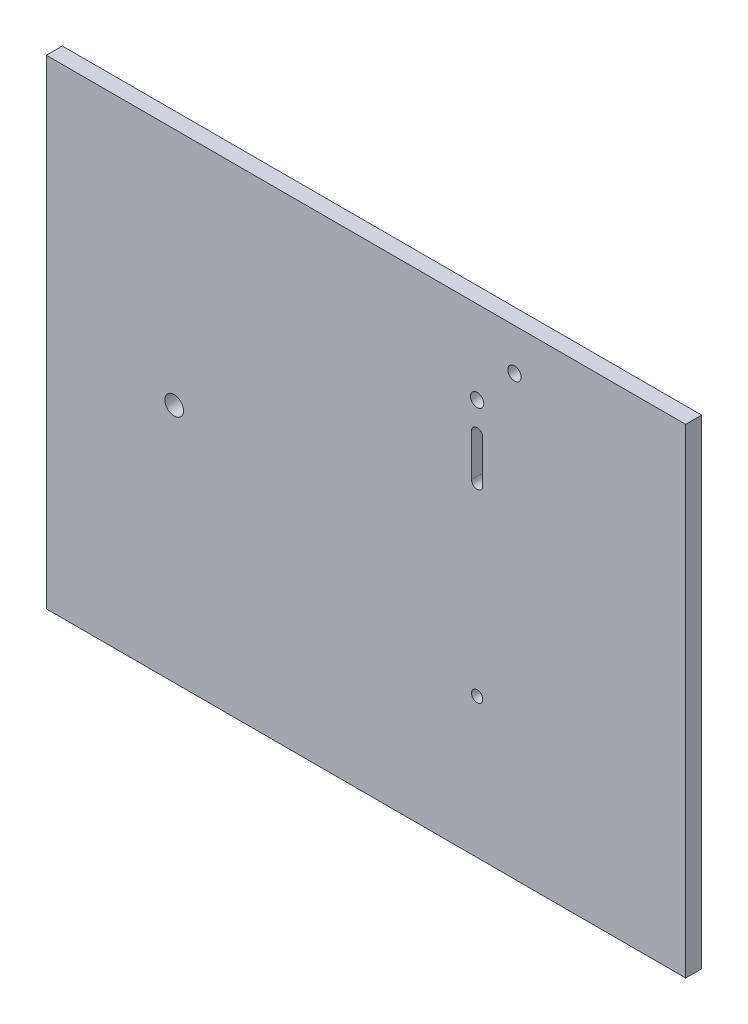
ISO-10303-21;
HEADER;
FILE_DESCRIPTION(('STEP AP214'),'2;1');
FILE_NAME('part.step','',(''),(''),'','','');
FILE_SCHEMA(('AUTOMOTIVE_DESIGN { 1 0 10303 214 1 1 1 1 }'));
ENDSEC;
DATA;
#1=APPLICATION_CONTEXT('core data for automotive mechanical design processes');
#2=APPLICATION_PROTOCOL_DEFINITION('international standard','automotive_design',2000,#1);
#3=PRODUCT_CONTEXT('',#1,'mechanical');
#4=PRODUCT('Part','Part','',(#3));
#5=PRODUCT_RELATED_PRODUCT_CATEGORY('part','',(#4));
#6=PRODUCT_DEFINITION_FORMATION('','',#4);
#7=PRODUCT_DEFINITION_CONTEXT('part definition',#1,'design');
#8=PRODUCT_DEFINITION('design','',#6,#7);
#9=PRODUCT_DEFINITION_SHAPE('','',#8);
#10=(LENGTH_UNIT() NAMED_UNIT(*) SI_UNIT(.MILLI.,.METRE.));
#11=(NAMED_UNIT(*) PLANE_ANGLE_UNIT() SI_UNIT($,.RADIAN.));
#12=(NAMED_UNIT(*) SI_UNIT($,.STERADIAN.) SOLID_ANGLE_UNIT());
#13=UNCERTAINTY_MEASURE_WITH_UNIT(LENGTH_MEASURE(1.E-05),#10,'distance_accuracy_value','');
#14=(GEOMETRIC_REPRESENTATION_CONTEXT(3) GLOBAL_UNCERTAINTY_ASSIGNED_CONTEXT((#13)) GLOBAL_UNIT_ASSIGNED_CONTEXT((#10,
#11,#12)) REPRESENTATION_CONTEXT('',''));
#15=CARTESIAN_POINT('',(0.,0.,0.));
#16=DIRECTION('',(0.,0.,1.));
#17=DIRECTION('',(1.,0.,0.));
#18=AXIS2_PLACEMENT_3D('',#15,#16,#17);
#19=CARTESIAN_POINT('',(120.,0.,3.));
#20=DIRECTION('',(1.,0.,0.));
#21=DIRECTION('',(0.,1.,0.));
#22=AXIS2_PLACEMENT_3D('',#19,#20,#21);
#23=PLANE('',#22);
#24=DIRECTION('',(0.,-1.,0.));
#25=VECTOR('',#24,1.);
#26=CARTESIAN_POINT('',(120.,0.,0.));
#27=LINE('',#26,#25);
#28=CARTESIAN_POINT('',(120.,0.,0.));
#29=VERTEX_POINT('',#28);
#30=CARTESIAN_POINT('',(120.,-90.,0.));
#31=VERTEX_POINT('',#30);
#32=EDGE_CURVE('E148',#29,#31,#27,.T.);
#33=ORIENTED_EDGE('',*,*,#32,.F.);
#34=DIRECTION('',(0.,0.,-1.));
#35=VECTOR('',#34,1.);
#36=CARTESIAN_POINT('',(120.,0.,3.));
#37=LINE('',#36,#35);
#38=CARTESIAN_POINT('',(120.,0.,3.));
#39=VERTEX_POINT('',#38);
#40=EDGE_CURVE('E11',#39,#29,#37,.T.);
#41=ORIENTED_EDGE('',*,*,#40,.F.);
#42=DIRECTION('',(0.,-1.,0.));
#43=VECTOR('',#42,1.);
#44=CARTESIAN_POINT('',(120.,0.,3.));
#45=LINE('',#44,#43);
#46=CARTESIAN_POINT('',(120.,-90.,3.));
#47=VERTEX_POINT('',#46);
#48=EDGE_CURVE('E136',#39,#47,#45,.T.);
#49=ORIENTED_EDGE('',*,*,#48,.T.);
#50=DIRECTION('',(0.,0.,-1.));
#51=VECTOR('',#50,1.);
#52=CARTESIAN_POINT('',(120.,-90.,3.));
#53=LINE('',#52,#51);
#54=EDGE_CURVE('E147',#47,#31,#53,.T.);
#55=ORIENTED_EDGE('',*,*,#54,.T.);
#56=EDGE_LOOP('',(#33,#41,#49,#55));
#57=FACE_BOUND('',#56,.T.);
#58=ADVANCED_FACE('F41',(#57),#23,.T.);
#59=CARTESIAN_POINT('',(0.,0.,3.));
#60=DIRECTION('',(0.,1.,0.));
#61=DIRECTION('',(-1.,0.,0.));
#62=AXIS2_PLACEMENT_3D('',#59,#60,#61);
#63=PLANE('',#62);
#64=DIRECTION('',(1.,0.,0.));
#65=VECTOR('',#64,1.);
#66=CARTESIAN_POINT('',(0.,0.,0.));
#67=LINE('',#66,#65);
#68=CARTESIAN_POINT('',(0.,0.,0.));
#69=VERTEX_POINT('',#68);
#70=EDGE_CURVE('E151',#69,#29,#67,.T.);
#71=ORIENTED_EDGE('',*,*,#70,.F.);
#72=DIRECTION('',(0.,0.,-1.));
#73=VECTOR('',#72,1.);
#74=CARTESIAN_POINT('',(0.,0.,3.));
#75=LINE('',#74,#73);
#76=CARTESIAN_POINT('',(0.,0.,3.));
#77=VERTEX_POINT('',#76);
#78=EDGE_CURVE('E48',#77,#69,#75,.T.);
#79=ORIENTED_EDGE('',*,*,#78,.F.);
#80=DIRECTION('',(1.,0.,0.));
#81=VECTOR('',#80,1.);
#82=CARTESIAN_POINT('',(0.,0.,3.));
#83=LINE('',#82,#81);
#84=EDGE_CURVE('E139',#77,#39,#83,.T.);
#85=ORIENTED_EDGE('',*,*,#84,.T.);
#86=ORIENTED_EDGE('',*,*,#40,.T.);
#87=EDGE_LOOP('',(#71,#79,#85,#86));
#88=FACE_BOUND('',#87,.T.);
#89=ADVANCED_FACE('F173',(#88),#63,.T.);
#90=CARTESIAN_POINT('',(0.,0.,3.));
#91=DIRECTION('',(1.,0.,0.));
#92=DIRECTION('',(0.,1.,0.));
#93=AXIS2_PLACEMENT_3D('',#90,#91,#92);
#94=PLANE('',#93);
#95=DIRECTION('',(0.,-1.,0.));
#96=VECTOR('',#95,1.);
#97=CARTESIAN_POINT('',(0.,0.,0.));
#98=LINE('',#97,#96);
#99=CARTESIAN_POINT('',(0.,-90.,0.));
#100=VERTEX_POINT('',#99);
#101=EDGE_CURVE('E155',#69,#100,#98,.T.);
#102=ORIENTED_EDGE('',*,*,#101,.T.);
#103=DIRECTION('',(0.,0.,-1.));
#104=VECTOR('',#103,1.);
#105=CARTESIAN_POINT('',(0.,-90.,3.));
#106=LINE('',#105,#104);
#107=CARTESIAN_POINT('',(0.,-90.,3.));
#108=VERTEX_POINT('',#107);
#109=EDGE_CURVE('E160',#108,#100,#106,.T.);
#110=ORIENTED_EDGE('',*,*,#109,.F.);
#111=DIRECTION('',(0.,-1.,0.));
#112=VECTOR('',#111,1.);
#113=CARTESIAN_POINT('',(0.,0.,3.));
#114=LINE('',#113,#112);
#115=EDGE_CURVE('E143',#77,#108,#114,.T.);
#116=ORIENTED_EDGE('',*,*,#115,.F.);
#117=ORIENTED_EDGE('',*,*,#78,.T.);
#118=EDGE_LOOP('',(#102,#110,#116,#117));
#119=FACE_BOUND('',#118,.T.);
#120=ADVANCED_FACE('F165',(#119),#94,.F.);
#121=CARTESIAN_POINT('',(0.,-90.,3.));
#122=DIRECTION('',(0.,1.,0.));
#123=DIRECTION('',(-1.,0.,0.));
#124=AXIS2_PLACEMENT_3D('',#121,#122,#123);
#125=PLANE('',#124);
#126=DIRECTION('',(1.,0.,0.));
#127=VECTOR('',#126,1.);
#128=CARTESIAN_POINT('',(0.,-90.,0.));
#129=LINE('',#128,#127);
#130=EDGE_CURVE('E140',#100,#31,#129,.T.);
#131=ORIENTED_EDGE('',*,*,#130,.T.);
#132=ORIENTED_EDGE('',*,*,#54,.F.);
#133=DIRECTION('',(1.,0.,0.));
#134=VECTOR('',#133,1.);
#135=CARTESIAN_POINT('',(0.,-90.,3.));
#136=LINE('',#135,#134);
#137=EDGE_CURVE('E145',#108,#47,#136,.T.);
#138=ORIENTED_EDGE('',*,*,#137,.F.);
#139=ORIENTED_EDGE('',*,*,#109,.T.);
#140=EDGE_LOOP('',(#131,#132,#138,#139));
#141=FACE_BOUND('',#140,.T.);
#142=ADVANCED_FACE('F180',(#141),#125,.F.);
#143=CARTESIAN_POINT('',(0.,0.,3.));
#144=DIRECTION('',(0.,0.,1.));
#145=DIRECTION('',(1.,0.,0.));
#146=AXIS2_PLACEMENT_3D('',#143,#144,#145);
#147=PLANE('',#146);
#148=CARTESIAN_POINT('',(80.8563661477538,-15.5995627098244,3.));
#149=DIRECTION('',(0.,0.,1.));
#150=DIRECTION('',(1.,0.,0.));
#151=AXIS2_PLACEMENT_3D('',#148,#149,#150);
#152=CIRCLE('',#151,1.25);
#153=CARTESIAN_POINT('',(82.1063661477538,-15.5995627098244,3.));
#154=VERTEX_POINT('',#153);
#155=EDGE_CURVE('E301',#154,#154,#152,.T.);
#156=ORIENTED_EDGE('',*,*,#155,.F.);
#157=EDGE_LOOP('',(#156));
#158=FACE_BOUND('',#157,.T.);
#159=CARTESIAN_POINT('',(87.8703613312857,-7.78586502144467,3.));
#160=DIRECTION('',(0.,0.,1.));
#161=DIRECTION('',(1.,0.,0.));
#162=AXIS2_PLACEMENT_3D('',#159,#160,#161);
#163=CIRCLE('',#162,1.25);
#164=CARTESIAN_POINT('',(89.1203613312857,-7.78586502144467,3.));
#165=VERTEX_POINT('',#164);
#166=EDGE_CURVE('E306',#165,#165,#163,.T.);
#167=ORIENTED_EDGE('',*,*,#166,.F.);
#168=EDGE_LOOP('',(#167));
#169=FACE_BOUND('',#168,.T.);
#170=CARTESIAN_POINT('',(24.,-44.9,3.));
#171=DIRECTION('',(0.,0.,1.));
#172=DIRECTION('',(1.,0.,0.));
#173=AXIS2_PLACEMENT_3D('',#170,#171,#172);
#174=CIRCLE('',#173,1.75);
#175=CARTESIAN_POINT('',(25.75,-44.9,3.));
#176=VERTEX_POINT('',#175);
#177=EDGE_CURVE('E311',#176,#176,#174,.T.);
#178=ORIENTED_EDGE('',*,*,#177,.F.);
#179=EDGE_LOOP('',(#178));
#180=FACE_BOUND('',#179,.T.);
#181=CARTESIAN_POINT('',(80.8563661477536,-63.7626274991597,3.));
#182=DIRECTION('',(0.,0.,1.));
#183=DIRECTION('',(1.,0.,0.));
#184=AXIS2_PLACEMENT_3D('',#181,#182,#183);
#185=CIRCLE('',#184,1.05000000000103);
#186=CARTESIAN_POINT('',(81.9063661477546,-63.7626274991597,3.));
#187=VERTEX_POINT('',#186);
#188=EDGE_CURVE('E134',#187,#187,#185,.T.);
#189=ORIENTED_EDGE('',*,*,#188,.F.);
#190=EDGE_LOOP('',(#189));
#191=FACE_BOUND('',#190,.T.);
#192=CARTESIAN_POINT('',(80.8563661477538,-29.0907468849563,3.));
#193=DIRECTION('',(0.,0.,1.));
#194=DIRECTION('',(1.,0.,0.));
#195=AXIS2_PLACEMENT_3D('',#192,#193,#194);
#196=CIRCLE('',#195,1.05);
#197=CARTESIAN_POINT('',(79.8063661477538,-29.0907468849563,3.));
#198=VERTEX_POINT('',#197);
#199=CARTESIAN_POINT('',(81.9063661477538,-29.0907468849563,3.));
#200=VERTEX_POINT('',#199);
#201=EDGE_CURVE('E55',#198,#200,#196,.T.);
#202=ORIENTED_EDGE('',*,*,#201,.F.);
#203=DIRECTION('',(0.,-1.,0.));
#204=VECTOR('',#203,1.);
#205=CARTESIAN_POINT('',(79.8063661477538,-29.0907468849563,3.));
#206=LINE('',#205,#204);
#207=CARTESIAN_POINT('',(79.8063661477538,-21.1495627098244,3.));
#208=VERTEX_POINT('',#207);
#209=EDGE_CURVE('E123',#208,#198,#206,.T.);
#210=ORIENTED_EDGE('',*,*,#209,.F.);
#211=CARTESIAN_POINT('',(80.8563661477538,-21.1495627098244,3.));
#212=DIRECTION('',(0.,0.,1.));
#213=DIRECTION('',(1.,0.,0.));
#214=AXIS2_PLACEMENT_3D('',#211,#212,#213);
#215=CIRCLE('',#214,1.05);
#216=CARTESIAN_POINT('',(81.9063661477538,-21.1495627098244,3.));
#217=VERTEX_POINT('',#216);
#218=EDGE_CURVE('E107',#217,#208,#215,.T.);
#219=ORIENTED_EDGE('',*,*,#218,.F.);
#220=DIRECTION('',(0.,1.,0.));
#221=VECTOR('',#220,1.);
#222=CARTESIAN_POINT('',(81.9063661477538,-29.0907468849563,3.));
#223=LINE('',#222,#221);
#224=EDGE_CURVE('E116',#200,#217,#223,.T.);
#225=ORIENTED_EDGE('',*,*,#224,.F.);
#226=EDGE_LOOP('',(#202,#210,#219,#225));
#227=FACE_BOUND('',#226,.T.);
#228=ORIENTED_EDGE('',*,*,#48,.F.);
#229=ORIENTED_EDGE('',*,*,#84,.F.);
#230=ORIENTED_EDGE('',*,*,#115,.T.);
#231=ORIENTED_EDGE('',*,*,#137,.T.);
#232=EDGE_LOOP('',(#228,#229,#230,#231));
#233=FACE_BOUND('',#232,.T.);
#234=ADVANCED_FACE('F120',(#158,#169,#180,#191,#227,#233),#147,.T.);
#235=CARTESIAN_POINT('',(0.,0.,0.));
#236=DIRECTION('',(0.,0.,1.));
#237=DIRECTION('',(1.,0.,0.));
#238=AXIS2_PLACEMENT_3D('',#235,#236,#237);
#239=PLANE('',#238);
#240=CARTESIAN_POINT('',(80.8563661477538,-15.5995627098244,0.));
#241=DIRECTION('',(0.,0.,1.));
#242=DIRECTION('',(1.,0.,0.));
#243=AXIS2_PLACEMENT_3D('',#240,#241,#242);
#244=CIRCLE('',#243,1.25);
#245=CARTESIAN_POINT('',(82.1063661477538,-15.5995627098244,0.));
#246=VERTEX_POINT('',#245);
#247=EDGE_CURVE('E299',#246,#246,#244,.F.);
#248=ORIENTED_EDGE('',*,*,#247,.F.);
#249=EDGE_LOOP('',(#248));
#250=FACE_BOUND('',#249,.T.);
#251=CARTESIAN_POINT('',(87.8703613312857,-7.78586502144467,0.));
#252=DIRECTION('',(0.,0.,1.));
#253=DIRECTION('',(1.,0.,0.));
#254=AXIS2_PLACEMENT_3D('',#251,#252,#253);
#255=CIRCLE('',#254,1.25);
#256=CARTESIAN_POINT('',(89.1203613312857,-7.78586502144467,0.));
#257=VERTEX_POINT('',#256);
#258=EDGE_CURVE('E302',#257,#257,#255,.F.);
#259=ORIENTED_EDGE('',*,*,#258,.F.);
#260=EDGE_LOOP('',(#259));
#261=FACE_BOUND('',#260,.T.);
#262=CARTESIAN_POINT('',(24.,-44.9,0.));
#263=DIRECTION('',(0.,0.,1.));
#264=DIRECTION('',(1.,0.,0.));
#265=AXIS2_PLACEMENT_3D('',#262,#263,#264);
#266=CIRCLE('',#265,1.75);
#267=CARTESIAN_POINT('',(25.75,-44.9,0.));
#268=VERTEX_POINT('',#267);
#269=EDGE_CURVE('E152',#268,#268,#266,.F.);
#270=ORIENTED_EDGE('',*,*,#269,.F.);
#271=EDGE_LOOP('',(#270));
#272=FACE_BOUND('',#271,.T.);
#273=CARTESIAN_POINT('',(80.8563661477536,-63.7626274991597,0.));
#274=DIRECTION('',(0.,0.,1.));
#275=DIRECTION('',(1.,0.,0.));
#276=AXIS2_PLACEMENT_3D('',#273,#274,#275);
#277=CIRCLE('',#276,1.05000000000103);
#278=CARTESIAN_POINT('',(81.9063661477546,-63.7626274991597,0.));
#279=VERTEX_POINT('',#278);
#280=EDGE_CURVE('E314',#279,#279,#277,.F.);
#281=ORIENTED_EDGE('',*,*,#280,.F.);
#282=EDGE_LOOP('',(#281));
#283=FACE_BOUND('',#282,.T.);
#284=DIRECTION('',(0.,1.,0.));
#285=VECTOR('',#284,1.);
#286=CARTESIAN_POINT('',(79.8063661477538,-29.0907468849563,0.));
#287=LINE('',#286,#285);
#288=CARTESIAN_POINT('',(79.8063661477538,-29.0907468849563,0.));
#289=VERTEX_POINT('',#288);
#290=CARTESIAN_POINT('',(79.8063661477538,-21.1495627098244,0.));
#291=VERTEX_POINT('',#290);
#292=EDGE_CURVE('E322',#289,#291,#287,.T.);
#293=ORIENTED_EDGE('',*,*,#292,.F.);
#294=CARTESIAN_POINT('',(80.8563661477538,-29.0907468849563,0.));
#295=DIRECTION('',(0.,0.,1.));
#296=DIRECTION('',(1.,0.,0.));
#297=AXIS2_PLACEMENT_3D('',#294,#295,#296);
#298=CIRCLE('',#297,1.05);
#299=CARTESIAN_POINT('',(81.9063661477538,-29.0907468849563,0.));
#300=VERTEX_POINT('',#299);
#301=EDGE_CURVE('E135',#300,#289,#298,.F.);
#302=ORIENTED_EDGE('',*,*,#301,.F.);
#303=DIRECTION('',(0.,-1.,0.));
#304=VECTOR('',#303,1.);
#305=CARTESIAN_POINT('',(81.9063661477538,-29.0907468849563,0.));
#306=LINE('',#305,#304);
#307=CARTESIAN_POINT('',(81.9063661477538,-21.1495627098244,0.));
#308=VERTEX_POINT('',#307);
#309=EDGE_CURVE('E132',#308,#300,#306,.T.);
#310=ORIENTED_EDGE('',*,*,#309,.F.);
#311=CARTESIAN_POINT('',(80.8563661477538,-21.1495627098244,0.));
#312=DIRECTION('',(0.,0.,1.));
#313=DIRECTION('',(1.,0.,0.));
#314=AXIS2_PLACEMENT_3D('',#311,#312,#313);
#315=CIRCLE('',#314,1.05);
#316=EDGE_CURVE('E110',#291,#308,#315,.F.);
#317=ORIENTED_EDGE('',*,*,#316,.F.);
#318=EDGE_LOOP('',(#293,#302,#310,#317));
#319=FACE_BOUND('',#318,.T.);
#320=ORIENTED_EDGE('',*,*,#32,.T.);
#321=ORIENTED_EDGE('',*,*,#130,.F.);
#322=ORIENTED_EDGE('',*,*,#101,.F.);
#323=ORIENTED_EDGE('',*,*,#70,.T.);
#324=EDGE_LOOP('',(#320,#321,#322,#323));
#325=FACE_BOUND('',#324,.T.);
#326=ADVANCED_FACE('F172',(#250,#261,#272,#283,#319,#325),#239,.F.);
#327=CARTESIAN_POINT('',(80.8563661477538,-29.0907468849563,-10.2584296867951));
#328=DIRECTION('',(0.,0.,1.));
#329=DIRECTION('',(1.,0.,0.));
#330=AXIS2_PLACEMENT_3D('',#327,#328,#329);
#331=CYLINDRICAL_SURFACE('',#330,1.05);
#332=ORIENTED_EDGE('',*,*,#301,.T.);
#333=DIRECTION('',(0.,0.,1.));
#334=VECTOR('',#333,1.);
#335=CARTESIAN_POINT('',(79.8063661477538,-29.0907468849563,-10.2584296867951));
#336=LINE('',#335,#334);
#337=EDGE_CURVE('E128',#289,#198,#336,.T.);
#338=ORIENTED_EDGE('',*,*,#337,.T.);
#339=ORIENTED_EDGE('',*,*,#201,.T.);
#340=DIRECTION('',(0.,0.,1.));
#341=VECTOR('',#340,1.);
#342=CARTESIAN_POINT('',(81.9063661477538,-29.0907468849563,-10.2584296867951));
#343=LINE('',#342,#341);
#344=EDGE_CURVE('E113',#300,#200,#343,.T.);
#345=ORIENTED_EDGE('',*,*,#344,.F.);
#346=EDGE_LOOP('',(#332,#338,#339,#345));
#347=FACE_BOUND('',#346,.T.);
#348=ADVANCED_FACE('F188',(#347),#331,.F.);
#349=CARTESIAN_POINT('',(79.8063661477538,-29.0907468849563,-10.2584296867951));
#350=DIRECTION('',(-1.,0.,0.));
#351=DIRECTION('',(0.,0.,1.));
#352=AXIS2_PLACEMENT_3D('',#349,#350,#351);
#353=PLANE('',#352);
#354=ORIENTED_EDGE('',*,*,#292,.T.);
#355=DIRECTION('',(0.,0.,1.));
#356=VECTOR('',#355,1.);
#357=CARTESIAN_POINT('',(79.8063661477538,-21.1495627098244,-10.2584296867951));
#358=LINE('',#357,#356);
#359=EDGE_CURVE('E112',#291,#208,#358,.T.);
#360=ORIENTED_EDGE('',*,*,#359,.T.);
#361=ORIENTED_EDGE('',*,*,#209,.T.);
#362=ORIENTED_EDGE('',*,*,#337,.F.);
#363=EDGE_LOOP('',(#354,#360,#361,#362));
#364=FACE_BOUND('',#363,.T.);
#365=ADVANCED_FACE('F219',(#364),#353,.F.);
#366=CARTESIAN_POINT('',(80.8563661477538,-21.1495627098244,-10.2584296867951));
#367=DIRECTION('',(0.,0.,1.));
#368=DIRECTION('',(1.,0.,0.));
#369=AXIS2_PLACEMENT_3D('',#366,#367,#368);
#370=CYLINDRICAL_SURFACE('',#369,1.05);
#371=ORIENTED_EDGE('',*,*,#316,.T.);
#372=DIRECTION('',(0.,0.,1.));
#373=VECTOR('',#372,1.);
#374=CARTESIAN_POINT('',(81.9063661477538,-21.1495627098244,-10.2584296867951));
#375=LINE('',#374,#373);
#376=EDGE_CURVE('E63',#308,#217,#375,.T.);
#377=ORIENTED_EDGE('',*,*,#376,.T.);
#378=ORIENTED_EDGE('',*,*,#218,.T.);
#379=ORIENTED_EDGE('',*,*,#359,.F.);
#380=EDGE_LOOP('',(#371,#377,#378,#379));
#381=FACE_BOUND('',#380,.T.);
#382=ADVANCED_FACE('F104',(#381),#370,.F.);
#383=CARTESIAN_POINT('',(81.9063661477538,-29.0907468849563,-10.2584296867951));
#384=DIRECTION('',(1.,0.,0.));
#385=DIRECTION('',(0.,0.,-1.));
#386=AXIS2_PLACEMENT_3D('',#383,#384,#385);
#387=PLANE('',#386);
#388=ORIENTED_EDGE('',*,*,#309,.T.);
#389=ORIENTED_EDGE('',*,*,#344,.T.);
#390=ORIENTED_EDGE('',*,*,#224,.T.);
#391=ORIENTED_EDGE('',*,*,#376,.F.);
#392=EDGE_LOOP('',(#388,#389,#390,#391));
#393=FACE_BOUND('',#392,.T.);
#394=ADVANCED_FACE('F117',(#393),#387,.F.);
#395=CARTESIAN_POINT('',(80.8563661477536,-63.7626274991597,-10.2584296867951));
#396=DIRECTION('',(0.,0.,1.));
#397=DIRECTION('',(1.,0.,0.));
#398=AXIS2_PLACEMENT_3D('',#395,#396,#397);
#399=CYLINDRICAL_SURFACE('',#398,1.05000000000103);
#400=CARTESIAN_POINT('',(81.9063661477546,-63.7626274991597,0.));
#401=CARTESIAN_POINT('',(81.9063661477546,-63.7626274991597,0.0312499999999983));
#402=CARTESIAN_POINT('',(81.9063661477546,-63.7626274991597,0.0624999999999983));
#403=CARTESIAN_POINT('',(81.9063661477546,-63.7626274991597,0.124999999999998));
#404=CARTESIAN_POINT('',(81.9063661477546,-63.7626274991597,0.156249999999998));
#405=CARTESIAN_POINT('',(81.9063661477546,-63.7626274991597,0.218749999999998));
#406=CARTESIAN_POINT('',(81.9063661477546,-63.7626274991597,0.249999999999999));
#407=CARTESIAN_POINT('',(81.9063661477546,-63.7626274991597,0.312499999999999));
#408=CARTESIAN_POINT('',(81.9063661477546,-63.7626274991597,0.343749999999999));
#409=CARTESIAN_POINT('',(81.9063661477546,-63.7626274991597,0.406249999999999));
#410=CARTESIAN_POINT('',(81.9063661477546,-63.7626274991597,0.437499999999999));
#411=CARTESIAN_POINT('',(81.9063661477546,-63.7626274991597,0.499999999999999));
#412=CARTESIAN_POINT('',(81.9063661477546,-63.7626274991597,0.531249999999999));
#413=CARTESIAN_POINT('',(81.9063661477546,-63.7626274991597,0.593749999999999));
#414=CARTESIAN_POINT('',(81.9063661477546,-63.7626274991597,0.624999999999999));
#415=CARTESIAN_POINT('',(81.9063661477546,-63.7626274991597,0.687499999999999));
#416=CARTESIAN_POINT('',(81.9063661477546,-63.7626274991597,0.718749999999999));
#417=CARTESIAN_POINT('',(81.9063661477546,-63.7626274991597,0.781249999999999));
#418=CARTESIAN_POINT('',(81.9063661477546,-63.7626274991597,0.812499999999999));
#419=CARTESIAN_POINT('',(81.9063661477546,-63.7626274991597,0.874999999999999));
#420=CARTESIAN_POINT('',(81.9063661477546,-63.7626274991597,0.906249999999999));
#421=CARTESIAN_POINT('',(81.9063661477546,-63.7626274991597,0.968749999999999));
#422=CARTESIAN_POINT('',(81.9063661477546,-63.7626274991597,0.999999999999999));
#423=CARTESIAN_POINT('',(81.9063661477546,-63.7626274991597,1.0625));
#424=CARTESIAN_POINT('',(81.9063661477546,-63.7626274991597,1.09375));
#425=CARTESIAN_POINT('',(81.9063661477546,-63.7626274991597,1.15625));
#426=CARTESIAN_POINT('',(81.9063661477546,-63.7626274991597,1.1875));
#427=CARTESIAN_POINT('',(81.9063661477546,-63.7626274991597,1.25));
#428=CARTESIAN_POINT('',(81.9063661477546,-63.7626274991597,1.28125));
#429=CARTESIAN_POINT('',(81.9063661477546,-63.7626274991597,1.34375));
#430=CARTESIAN_POINT('',(81.9063661477546,-63.7626274991597,1.375));
#431=CARTESIAN_POINT('',(81.9063661477546,-63.7626274991597,1.4375));
#432=CARTESIAN_POINT('',(81.9063661477546,-63.7626274991597,1.46875));
#433=CARTESIAN_POINT('',(81.9063661477546,-63.7626274991597,1.53125));
#434=CARTESIAN_POINT('',(81.9063661477546,-63.7626274991597,1.5625));
#435=CARTESIAN_POINT('',(81.9063661477546,-63.7626274991597,1.625));
#436=CARTESIAN_POINT('',(81.9063661477546,-63.7626274991597,1.65625));
#437=CARTESIAN_POINT('',(81.9063661477546,-63.7626274991597,1.71875));
#438=CARTESIAN_POINT('',(81.9063661477546,-63.7626274991597,1.75));
#439=CARTESIAN_POINT('',(81.9063661477546,-63.7626274991597,1.8125));
#440=CARTESIAN_POINT('',(81.9063661477546,-63.7626274991597,1.84375));
#441=CARTESIAN_POINT('',(81.9063661477546,-63.7626274991597,1.90625));
#442=CARTESIAN_POINT('',(81.9063661477546,-63.7626274991597,1.9375));
#443=CARTESIAN_POINT('',(81.9063661477546,-63.7626274991597,2.));
#444=CARTESIAN_POINT('',(81.9063661477546,-63.7626274991597,2.03125));
#445=CARTESIAN_POINT('',(81.9063661477546,-63.7626274991597,2.09375));
#446=CARTESIAN_POINT('',(81.9063661477546,-63.7626274991597,2.125));
#447=CARTESIAN_POINT('',(81.9063661477546,-63.7626274991597,2.1875));
#448=CARTESIAN_POINT('',(81.9063661477546,-63.7626274991597,2.21875));
#449=CARTESIAN_POINT('',(81.9063661477546,-63.7626274991597,2.28125));
#450=CARTESIAN_POINT('',(81.9063661477546,-63.7626274991597,2.3125));
#451=CARTESIAN_POINT('',(81.9063661477546,-63.7626274991597,2.375));
#452=CARTESIAN_POINT('',(81.9063661477546,-63.7626274991597,2.40625));
#453=CARTESIAN_POINT('',(81.9063661477546,-63.7626274991597,2.46875));
#454=CARTESIAN_POINT('',(81.9063661477546,-63.7626274991597,2.5));
#455=CARTESIAN_POINT('',(81.9063661477546,-63.7626274991597,2.5625));
#456=CARTESIAN_POINT('',(81.9063661477546,-63.7626274991597,2.59375));
#457=CARTESIAN_POINT('',(81.9063661477546,-63.7626274991597,2.65625));
#458=CARTESIAN_POINT('',(81.9063661477546,-63.7626274991597,2.6875));
#459=CARTESIAN_POINT('',(81.9063661477546,-63.7626274991597,2.75));
#460=CARTESIAN_POINT('',(81.9063661477546,-63.7626274991597,2.78125));
#461=CARTESIAN_POINT('',(81.9063661477546,-63.7626274991597,2.84375));
#462=CARTESIAN_POINT('',(81.9063661477546,-63.7626274991597,2.875));
#463=CARTESIAN_POINT('',(81.9063661477546,-63.7626274991597,2.9375));
#464=CARTESIAN_POINT('',(81.9063661477546,-63.7626274991597,2.96875));
#465=CARTESIAN_POINT('',(81.9063661477546,-63.7626274991597,3.));
#466=B_SPLINE_CURVE_WITH_KNOTS('',3,(#400,#401,#402,#403,#404,#405,#406,#407,#408,#409,#410,
#411,#412,#413,#414,#415,#416,#417,#418,#419,#420,#421,#422,#423,#424,#425,#426,#427,#428,#429,
#430,#431,#432,#433,#434,#435,#436,#437,#438,#439,#440,#441,#442,#443,#444,#445,#446,#447,#448,
#449,#450,#451,#452,#453,#454,#455,#456,#457,#458,#459,#460,#461,#462,#463,#464,#465),
.UNSPECIFIED.,.F.,.F.,(4,2,2,2,2,2,2,2,2,2,2,2,2,2,2,2,2,2,2,2,2,2,2,2,2,2,2,2,2,2,2,2,4),(0.,
0.0937500000000001,0.1875,0.28125,0.375,0.46875,0.5625,0.656250000000001,0.750000000000001,
0.843750000000001,0.937500000000001,1.03125,1.125,1.21875,1.3125,1.40625,1.5,1.59375,1.6875,
1.78125,1.875,1.96875,2.0625,2.15625,2.25,2.34375,2.4375,2.53125,2.625,2.71875,2.8125,2.90625,
3.),.UNSPECIFIED.);
#467=EDGE_CURVE('BSEAM245',#279,#187,#466,.T.);
#468=ORIENTED_EDGE('',*,*,#280,.T.);
#469=ORIENTED_EDGE('',*,*,#188,.T.);
#470=ORIENTED_EDGE('',*,*,#467,.T.);
#471=ORIENTED_EDGE('',*,*,#467,.F.);
#472=EDGE_LOOP('',(#468,#470,#469,#471));
#473=FACE_BOUND('',#472,.T.);
#474=ADVANCED_FACE('F245',(#473),#399,.F.);
#475=CARTESIAN_POINT('',(24.,-44.9,-10.2584296867951));
#476=DIRECTION('',(0.,0.,1.));
#477=DIRECTION('',(1.,0.,0.));
#478=AXIS2_PLACEMENT_3D('',#475,#476,#477);
#479=CYLINDRICAL_SURFACE('',#478,1.75);
#480=CARTESIAN_POINT('',(25.75,-44.9,0.));
#481=CARTESIAN_POINT('',(25.75,-44.9,0.0312499999999983));
#482=CARTESIAN_POINT('',(25.75,-44.9,0.0624999999999983));
#483=CARTESIAN_POINT('',(25.75,-44.9,0.124999999999998));
#484=CARTESIAN_POINT('',(25.75,-44.9,0.156249999999998));
#485=CARTESIAN_POINT('',(25.75,-44.9,0.218749999999998));
#486=CARTESIAN_POINT('',(25.75,-44.9,0.249999999999999));
#487=CARTESIAN_POINT('',(25.75,-44.9,0.312499999999999));
#488=CARTESIAN_POINT('',(25.75,-44.9,0.343749999999999));
#489=CARTESIAN_POINT('',(25.75,-44.9,0.406249999999999));
#490=CARTESIAN_POINT('',(25.75,-44.9,0.437499999999999));
#491=CARTESIAN_POINT('',(25.75,-44.9,0.499999999999999));
#492=CARTESIAN_POINT('',(25.75,-44.9,0.531249999999999));
#493=CARTESIAN_POINT('',(25.75,-44.9,0.593749999999999));
#494=CARTESIAN_POINT('',(25.75,-44.9,0.624999999999999));
#495=CARTESIAN_POINT('',(25.75,-44.9,0.687499999999999));
#496=CARTESIAN_POINT('',(25.75,-44.9,0.718749999999999));
#497=CARTESIAN_POINT('',(25.75,-44.9,0.781249999999999));
#498=CARTESIAN_POINT('',(25.75,-44.9,0.812499999999999));
#499=CARTESIAN_POINT('',(25.75,-44.9,0.874999999999999));
#500=CARTESIAN_POINT('',(25.75,-44.9,0.906249999999999));
#501=CARTESIAN_POINT('',(25.75,-44.9,0.968749999999999));
#502=CARTESIAN_POINT('',(25.75,-44.9,0.999999999999999));
#503=CARTESIAN_POINT('',(25.75,-44.9,1.0625));
#504=CARTESIAN_POINT('',(25.75,-44.9,1.09375));
#505=CARTESIAN_POINT('',(25.75,-44.9,1.15625));
#506=CARTESIAN_POINT('',(25.75,-44.9,1.1875));
#507=CARTESIAN_POINT('',(25.75,-44.9,1.25));
#508=CARTESIAN_POINT('',(25.75,-44.9,1.28125));
#509=CARTESIAN_POINT('',(25.75,-44.9,1.34375));
#510=CARTESIAN_POINT('',(25.75,-44.9,1.375));
#511=CARTESIAN_POINT('',(25.75,-44.9,1.4375));
#512=CARTESIAN_POINT('',(25.75,-44.9,1.46875));
#513=CARTESIAN_POINT('',(25.75,-44.9,1.53125));
#514=CARTESIAN_POINT('',(25.75,-44.9,1.5625));
#515=CARTESIAN_POINT('',(25.75,-44.9,1.625));
#516=CARTESIAN_POINT('',(25.75,-44.9,1.65625));
#517=CARTESIAN_POINT('',(25.75,-44.9,1.71875));
#518=CARTESIAN_POINT('',(25.75,-44.9,1.75));
#519=CARTESIAN_POINT('',(25.75,-44.9,1.8125));
#520=CARTESIAN_POINT('',(25.75,-44.9,1.84375));
#521=CARTESIAN_POINT('',(25.75,-44.9,1.90625));
#522=CARTESIAN_POINT('',(25.75,-44.9,1.9375));
#523=CARTESIAN_POINT('',(25.75,-44.9,2.));
#524=CARTESIAN_POINT('',(25.75,-44.9,2.03125));
#525=CARTESIAN_POINT('',(25.75,-44.9,2.09375));
#526=CARTESIAN_POINT('',(25.75,-44.9,2.125));
#527=CARTESIAN_POINT('',(25.75,-44.9,2.1875));
#528=CARTESIAN_POINT('',(25.75,-44.9,2.21875));
#529=CARTESIAN_POINT('',(25.75,-44.9,2.28125));
#530=CARTESIAN_POINT('',(25.75,-44.9,2.3125));
#531=CARTESIAN_POINT('',(25.75,-44.9,2.375));
#532=CARTESIAN_POINT('',(25.75,-44.9,2.40625));
#533=CARTESIAN_POINT('',(25.75,-44.9,2.46875));
#534=CARTESIAN_POINT('',(25.75,-44.9,2.5));
#535=CARTESIAN_POINT('',(25.75,-44.9,2.5625));
#536=CARTESIAN_POINT('',(25.75,-44.9,2.59375));
#537=CARTESIAN_POINT('',(25.75,-44.9,2.65625));
#538=CARTESIAN_POINT('',(25.75,-44.9,2.6875));
#539=CARTESIAN_POINT('',(25.75,-44.9,2.75));
#540=CARTESIAN_POINT('',(25.75,-44.9,2.78125));
#541=CARTESIAN_POINT('',(25.75,-44.9,2.84375));
#542=CARTESIAN_POINT('',(25.75,-44.9,2.875));
#543=CARTESIAN_POINT('',(25.75,-44.9,2.9375));
#544=CARTESIAN_POINT('',(25.75,-44.9,2.96875));
#545=CARTESIAN_POINT('',(25.75,-44.9,3.));
#546=B_SPLINE_CURVE_WITH_KNOTS('',3,(#480,#481,#482,#483,#484,#485,#486,#487,#488,#489,#490,
#491,#492,#493,#494,#495,#496,#497,#498,#499,#500,#501,#502,#503,#504,#505,#506,#507,#508,#509,
#510,#511,#512,#513,#514,#515,#516,#517,#518,#519,#520,#521,#522,#523,#524,#525,#526,#527,#528,
#529,#530,#531,#532,#533,#534,#535,#536,#537,#538,#539,#540,#541,#542,#543,#544,#545),
.UNSPECIFIED.,.F.,.F.,(4,2,2,2,2,2,2,2,2,2,2,2,2,2,2,2,2,2,2,2,2,2,2,2,2,2,2,2,2,2,2,2,4),(0.,
0.0937500000000001,0.1875,0.28125,0.375,0.46875,0.5625,0.656250000000001,0.750000000000001,
0.843750000000001,0.937500000000001,1.03125,1.125,1.21875,1.3125,1.40625,1.5,1.59375,1.6875,
1.78125,1.875,1.96875,2.0625,2.15625,2.25,2.34375,2.4375,2.53125,2.625,2.71875,2.8125,2.90625,
3.),.UNSPECIFIED.);
#547=EDGE_CURVE('BSEAM254',#268,#176,#546,.T.);
#548=ORIENTED_EDGE('',*,*,#269,.T.);
#549=ORIENTED_EDGE('',*,*,#177,.T.);
#550=ORIENTED_EDGE('',*,*,#547,.T.);
#551=ORIENTED_EDGE('',*,*,#547,.F.);
#552=EDGE_LOOP('',(#548,#550,#549,#551));
#553=FACE_BOUND('',#552,.T.);
#554=ADVANCED_FACE('F254',(#553),#479,.F.);
#555=CARTESIAN_POINT('',(87.8703613312857,-7.78586502144467,-3.53553390593274));
#556=DIRECTION('',(0.,0.,1.));
#557=DIRECTION('',(1.,0.,0.));
#558=AXIS2_PLACEMENT_3D('',#555,#556,#557);
#559=CYLINDRICAL_SURFACE('',#558,1.25);
#560=ORIENTED_EDGE('',*,*,#258,.T.);
#561=EDGE_LOOP('',(#560));
#562=FACE_BOUND('',#561,.T.);
#563=ORIENTED_EDGE('',*,*,#166,.T.);
#564=EDGE_LOOP('',(#563));
#565=FACE_BOUND('',#564,.T.);
#566=ADVANCED_FACE('F263',(#562,#565),#559,.F.);
#567=CARTESIAN_POINT('',(80.8563661477538,-15.5995627098244,-3.53553390593274));
#568=DIRECTION('',(0.,0.,1.));
#569=DIRECTION('',(1.,0.,0.));
#570=AXIS2_PLACEMENT_3D('',#567,#568,#569);
#571=CYLINDRICAL_SURFACE('',#570,1.25);
#572=ORIENTED_EDGE('',*,*,#247,.T.);
#573=EDGE_LOOP('',(#572));
#574=FACE_BOUND('',#573,.T.);
#575=ORIENTED_EDGE('',*,*,#155,.T.);
#576=EDGE_LOOP('',(#575));
#577=FACE_BOUND('',#576,.T.);
#578=ADVANCED_FACE('F282',(#574,#577),#571,.F.);
#579=CLOSED_SHELL('',(#58,#89,#120,#142,#234,#326,#348,#365,#382,#394,#474,#554,#566,#578));
#580=MANIFOLD_SOLID_BREP('B2',#579);
#581=ADVANCED_BREP_SHAPE_REPRESENTATION('',(#18,#580),#14);
#582=SHAPE_DEFINITION_REPRESENTATION(#9,#581);
ENDSEC;
END-ISO-10303-21;
